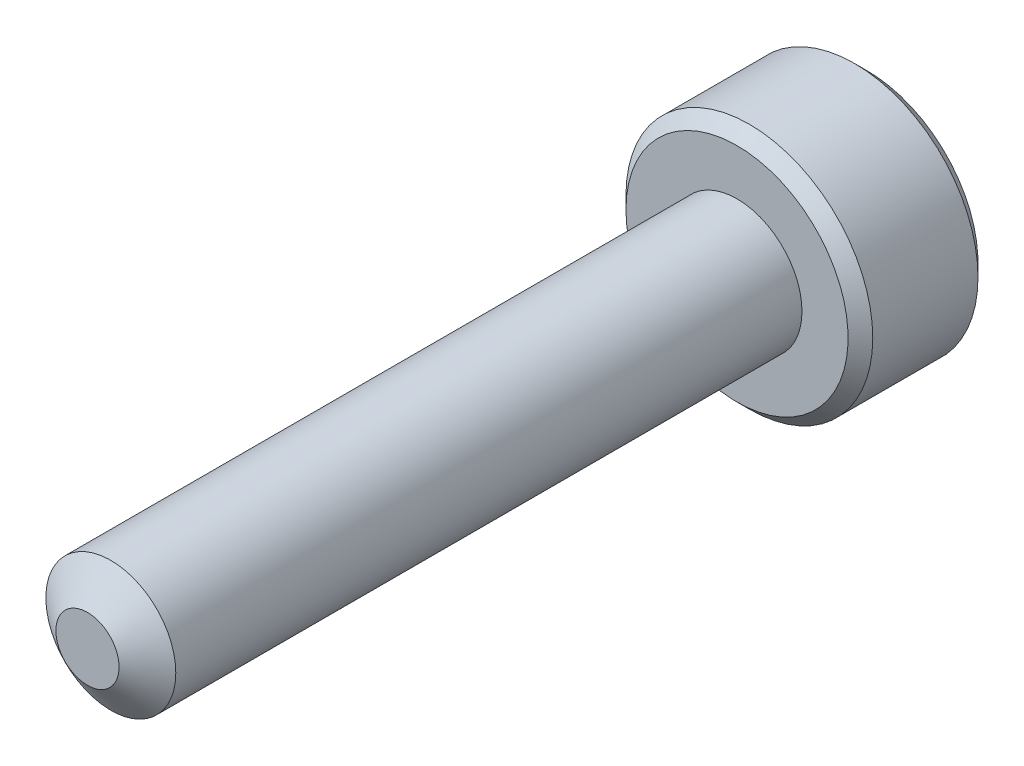
ISO-10303-21;
HEADER;
FILE_DESCRIPTION(('STEP AP214'),'2;1');
FILE_NAME('part.step','',(''),(''),'','','');
FILE_SCHEMA(('AUTOMOTIVE_DESIGN { 1 0 10303 214 1 1 1 1 }'));
ENDSEC;
DATA;
#1=APPLICATION_CONTEXT('core data for automotive mechanical design processes');
#2=APPLICATION_PROTOCOL_DEFINITION('international standard','automotive_design',2000,#1);
#3=PRODUCT_CONTEXT('',#1,'mechanical');
#4=PRODUCT('Part','Part','',(#3));
#5=PRODUCT_RELATED_PRODUCT_CATEGORY('part','',(#4));
#6=PRODUCT_DEFINITION_FORMATION('','',#4);
#7=PRODUCT_DEFINITION_CONTEXT('part definition',#1,'design');
#8=PRODUCT_DEFINITION('design','',#6,#7);
#9=PRODUCT_DEFINITION_SHAPE('','',#8);
#10=(LENGTH_UNIT() NAMED_UNIT(*) SI_UNIT(.MILLI.,.METRE.));
#11=(NAMED_UNIT(*) PLANE_ANGLE_UNIT() SI_UNIT($,.RADIAN.));
#12=(NAMED_UNIT(*) SI_UNIT($,.STERADIAN.) SOLID_ANGLE_UNIT());
#13=UNCERTAINTY_MEASURE_WITH_UNIT(LENGTH_MEASURE(1.E-05),#10,'distance_accuracy_value','');
#14=(GEOMETRIC_REPRESENTATION_CONTEXT(3) GLOBAL_UNCERTAINTY_ASSIGNED_CONTEXT((#13)) GLOBAL_UNIT_ASSIGNED_CONTEXT((#10,
#11,#12)) REPRESENTATION_CONTEXT('',''));
#15=CARTESIAN_POINT('',(0.,0.,0.));
#16=DIRECTION('',(0.,0.,1.));
#17=DIRECTION('',(1.,0.,0.));
#18=AXIS2_PLACEMENT_3D('',#15,#16,#17);
#19=CARTESIAN_POINT('',(0.,0.,-10.));
#20=DIRECTION('',(0.,0.,1.));
#21=DIRECTION('',(1.,0.,0.));
#22=AXIS2_PLACEMENT_3D('',#19,#20,#21);
#23=CYLINDRICAL_SURFACE('',#22,1.);
#24=CARTESIAN_POINT('',(0.,0.,-10.));
#25=DIRECTION('',(0.,0.,-1.));
#26=DIRECTION('',(-1.,0.,0.));
#27=AXIS2_PLACEMENT_3D('',#24,#25,#26);
#28=CIRCLE('',#27,1.);
#29=CARTESIAN_POINT('',(-1.,0.,-10.));
#30=VERTEX_POINT('',#29);
#31=EDGE_CURVE('E226',#30,#30,#28,.F.);
#32=ORIENTED_EDGE('',*,*,#31,.T.);
#33=EDGE_LOOP('',(#32));
#34=FACE_BOUND('',#33,.T.);
#35=CARTESIAN_POINT('',(0.,0.,-0.359771969508557));
#36=DIRECTION('',(0.,0.,1.));
#37=DIRECTION('',(1.,0.,0.));
#38=AXIS2_PLACEMENT_3D('',#35,#36,#37);
#39=CIRCLE('',#38,1.);
#40=CARTESIAN_POINT('',(1.,0.,-0.359771969508557));
#41=VERTEX_POINT('',#40);
#42=EDGE_CURVE('E120',#41,#41,#39,.T.);
#43=ORIENTED_EDGE('',*,*,#42,.F.);
#44=EDGE_LOOP('',(#43));
#45=FACE_BOUND('',#44,.T.);
#46=ADVANCED_FACE('F46',(#34,#45),#23,.T.);
#47=CARTESIAN_POINT('',(0.,0.,0.));
#48=DIRECTION('',(0.,0.,-1.));
#49=DIRECTION('',(-1.,0.,0.));
#50=AXIS2_PLACEMENT_3D('',#47,#48,#49);
#51=CONICAL_SURFACE('',#50,0.486192378864667,0.959931088596884);
#52=ORIENTED_EDGE('',*,*,#42,.T.);
#53=EDGE_LOOP('',(#52));
#54=FACE_BOUND('',#53,.T.);
#55=CARTESIAN_POINT('',(0.,0.,0.));
#56=DIRECTION('',(0.,0.,1.));
#57=DIRECTION('',(1.,0.,0.));
#58=AXIS2_PLACEMENT_3D('',#55,#56,#57);
#59=CIRCLE('',#58,0.486192378864667);
#60=CARTESIAN_POINT('',(0.486192378864667,0.,0.));
#61=VERTEX_POINT('',#60);
#62=EDGE_CURVE('E224',#61,#61,#59,.T.);
#63=ORIENTED_EDGE('',*,*,#62,.F.);
#64=EDGE_LOOP('',(#63));
#65=FACE_BOUND('',#64,.T.);
#66=ADVANCED_FACE('F207',(#54,#65),#51,.T.);
#67=CARTESIAN_POINT('',(0.,0.,0.));
#68=DIRECTION('',(0.,0.,1.));
#69=DIRECTION('',(1.,0.,0.));
#70=AXIS2_PLACEMENT_3D('',#67,#68,#69);
#71=PLANE('',#70);
#72=ORIENTED_EDGE('',*,*,#62,.T.);
#73=EDGE_LOOP('',(#72));
#74=FACE_BOUND('',#73,.T.);
#75=ADVANCED_FACE('F204',(#74),#71,.T.);
#76=CARTESIAN_POINT('',(0.,0.,-12.));
#77=DIRECTION('',(0.,0.,1.));
#78=DIRECTION('',(1.,0.,0.));
#79=AXIS2_PLACEMENT_3D('',#76,#77,#78);
#80=CYLINDRICAL_SURFACE('',#79,1.9);
#81=CARTESIAN_POINT('',(0.,0.,-11.81));
#82=DIRECTION('',(0.,0.,-1.));
#83=DIRECTION('',(-1.,0.,0.));
#84=AXIS2_PLACEMENT_3D('',#81,#82,#83);
#85=CIRCLE('',#84,1.9);
#86=CARTESIAN_POINT('',(-1.9,0.,-11.81));
#87=VERTEX_POINT('',#86);
#88=EDGE_CURVE('E54',#87,#87,#85,.F.);
#89=ORIENTED_EDGE('',*,*,#88,.T.);
#90=EDGE_LOOP('',(#89));
#91=FACE_BOUND('',#90,.T.);
#92=CARTESIAN_POINT('',(0.,0.,-10.19));
#93=DIRECTION('',(0.,0.,-1.));
#94=DIRECTION('',(-1.,0.,0.));
#95=AXIS2_PLACEMENT_3D('',#92,#93,#94);
#96=CIRCLE('',#95,1.9);
#97=CARTESIAN_POINT('',(-1.9,0.,-10.19));
#98=VERTEX_POINT('',#97);
#99=EDGE_CURVE('E183',#98,#98,#96,.T.);
#100=ORIENTED_EDGE('',*,*,#99,.T.);
#101=EDGE_LOOP('',(#100));
#102=FACE_BOUND('',#101,.T.);
#103=ADVANCED_FACE('F188',(#91,#102),#80,.T.);
#104=CARTESIAN_POINT('',(0.,0.,-12.));
#105=DIRECTION('',(0.,0.,-1.));
#106=DIRECTION('',(-1.,0.,0.));
#107=AXIS2_PLACEMENT_3D('',#104,#105,#106);
#108=PLANE('',#107);
#109=CARTESIAN_POINT('',(0.,0.,-12.));
#110=DIRECTION('',(0.,0.,-1.));
#111=DIRECTION('',(-1.,0.,0.));
#112=AXIS2_PLACEMENT_3D('',#109,#110,#111);
#113=CIRCLE('',#112,1.71);
#114=CARTESIAN_POINT('',(-1.71,0.,-12.));
#115=VERTEX_POINT('',#114);
#116=EDGE_CURVE('E119',#115,#115,#113,.T.);
#117=ORIENTED_EDGE('',*,*,#116,.T.);
#118=EDGE_LOOP('',(#117));
#119=FACE_BOUND('',#118,.T.);
#120=CARTESIAN_POINT('',(0.,0.,-12.));
#121=DIRECTION('',(0.,0.,-1.));
#122=DIRECTION('',(-1.,0.,0.));
#123=AXIS2_PLACEMENT_3D('',#120,#121,#122);
#124=CIRCLE('',#123,0.866025403784438);
#125=CARTESIAN_POINT('',(-0.749999999999999,0.43301270189222,-12.));
#126=VERTEX_POINT('',#125);
#127=CARTESIAN_POINT('',(0.,0.866025403784438,-12.));
#128=VERTEX_POINT('',#127);
#129=EDGE_CURVE('E100',#126,#128,#124,.T.);
#130=ORIENTED_EDGE('',*,*,#129,.F.);
#131=CARTESIAN_POINT('',(-0.749999999999999,-0.43301270189222,-12.));
#132=VERTEX_POINT('',#131);
#133=EDGE_CURVE('E60',#132,#126,#124,.T.);
#134=ORIENTED_EDGE('',*,*,#133,.F.);
#135=CARTESIAN_POINT('',(0.,-0.866025403784438,-12.));
#136=VERTEX_POINT('',#135);
#137=EDGE_CURVE('E285',#136,#132,#124,.T.);
#138=ORIENTED_EDGE('',*,*,#137,.F.);
#139=CARTESIAN_POINT('',(0.75,-0.433012701892219,-12.));
#140=VERTEX_POINT('',#139);
#141=EDGE_CURVE('E67',#140,#136,#124,.T.);
#142=ORIENTED_EDGE('',*,*,#141,.F.);
#143=CARTESIAN_POINT('',(0.749999999999999,0.43301270189222,-12.));
#144=VERTEX_POINT('',#143);
#145=EDGE_CURVE('E141',#144,#140,#124,.T.);
#146=ORIENTED_EDGE('',*,*,#145,.F.);
#147=EDGE_CURVE('E109',#128,#144,#124,.T.);
#148=ORIENTED_EDGE('',*,*,#147,.F.);
#149=EDGE_LOOP('',(#130,#134,#138,#142,#146,#148));
#150=FACE_BOUND('',#149,.T.);
#151=ADVANCED_FACE('F140',(#119,#150),#108,.T.);
#152=CARTESIAN_POINT('',(0.,0.,-10.));
#153=DIRECTION('',(0.,0.,-1.));
#154=DIRECTION('',(-1.,0.,0.));
#155=AXIS2_PLACEMENT_3D('',#152,#153,#154);
#156=PLANE('',#155);
#157=CARTESIAN_POINT('',(0.,0.,-10.));
#158=DIRECTION('',(0.,0.,-1.));
#159=DIRECTION('',(-1.,0.,0.));
#160=AXIS2_PLACEMENT_3D('',#157,#158,#159);
#161=CIRCLE('',#160,1.71);
#162=CARTESIAN_POINT('',(-1.71,0.,-10.));
#163=VERTEX_POINT('',#162);
#164=EDGE_CURVE('E13',#163,#163,#161,.F.);
#165=ORIENTED_EDGE('',*,*,#164,.T.);
#166=EDGE_LOOP('',(#165));
#167=FACE_BOUND('',#166,.T.);
#168=ORIENTED_EDGE('',*,*,#31,.F.);
#169=EDGE_LOOP('',(#168));
#170=FACE_BOUND('',#169,.T.);
#171=ADVANCED_FACE('F197',(#167,#170),#156,.F.);
#172=CARTESIAN_POINT('',(0.,0.,-12.));
#173=DIRECTION('',(0.,0.,-1.));
#174=DIRECTION('',(-1.,0.,0.));
#175=AXIS2_PLACEMENT_3D('',#172,#173,#174);
#176=CONICAL_SURFACE('',#175,0.866025403784438,0.78539816339745);
#177=ORIENTED_EDGE('',*,*,#147,.T.);
#178=CARTESIAN_POINT('',(-0.000199999999999593,0.866140873838276,-12.0001154931448));
#179=CARTESIAN_POINT('',(0.0255899625576818,0.851251032013208,-11.9852341104639));
#180=CARTESIAN_POINT('',(0.0518112021286595,0.836112192288419,-11.971226265607));
#181=CARTESIAN_POINT('',(0.105279708235707,0.805242135894348,-11.9455775246823));
#182=CARTESIAN_POINT('',(0.132532067460573,0.789507978959819,-11.9339509117057));
#183=CARTESIAN_POINT('',(0.187485350381353,0.757780686272653,-11.9140340457722));
#184=CARTESIAN_POINT('',(0.21517225669551,0.741795643459147,-11.9056936940814));
#185=CARTESIAN_POINT('',(0.271155595130853,0.709473647943367,-11.8928427419614));
#186=CARTESIAN_POINT('',(0.299450314843645,0.693137683900542,-11.8883225405888));
#187=CARTESIAN_POINT('',(0.348210289268843,0.664986099540475,-11.8842458330974));
#188=CARTESIAN_POINT('',(0.368612065655572,0.65320712845165,-11.8836427966141));
#189=CARTESIAN_POINT('',(0.40937613469636,0.629671982217687,-11.8846545060155));
#190=CARTESIAN_POINT('',(0.429738417651455,0.617915812672247,-11.88626974099));
#191=CARTESIAN_POINT('',(0.490534543086824,0.582815153286451,-11.894336146973));
#192=CARTESIAN_POINT('',(0.530665854996099,0.559645329552698,-11.9040089358277));
#193=CARTESIAN_POINT('',(0.601110400354026,0.518974152327358,-11.9273563179723));
#194=CARTESIAN_POINT('',(0.631753572009086,0.501282308923485,-11.9398085580723));
#195=CARTESIAN_POINT('',(0.691839345804789,0.466591771248069,-11.9678596102309));
#196=CARTESIAN_POINT('',(0.72128548838159,0.449591032904757,-11.9834481859038));
#197=CARTESIAN_POINT('',(0.7502,0.432897231838382,-12.0001154931448));
#198=B_SPLINE_CURVE_WITH_KNOTS('',3,(#178,#179,#180,#181,#182,#183,#184,#185,#186,#187,#188,
#189,#190,#191,#192,#193,#194,#195,#196,#197),.UNSPECIFIED.,.F.,.F.,(4,2,2,2,2,2,2,2,2,4),(0.,
0.0999419466095598,0.200466857654447,0.299393763705717,0.39807129730023,0.468665775681747,
0.539275821398839,0.680536257244566,0.792918418368073,0.904939568716031),.UNSPECIFIED.);
#199=EDGE_CURVE('E114',#128,#144,#198,.T.);
#200=ORIENTED_EDGE('',*,*,#199,.F.);
#201=EDGE_LOOP('',(#177,#200));
#202=FACE_BOUND('',#201,.T.);
#203=ADVANCED_FACE('F115',(#202),#176,.F.);
#204=ORIENTED_EDGE('',*,*,#145,.T.);
#205=CARTESIAN_POINT('',(0.75,-0.863604064974111,-12.2777892582303));
#206=CARTESIAN_POINT('',(0.75,-0.842575879856457,-12.2619149320996));
#207=CARTESIAN_POINT('',(0.75,-0.821430496410148,-12.2461962652706));
#208=CARTESIAN_POINT('',(0.75,-0.778857857530497,-12.2151345207069));
#209=CARTESIAN_POINT('',(0.75,-0.757430533150142,-12.1997915375702));
#210=CARTESIAN_POINT('',(0.75,-0.692340710809909,-12.1542035803594));
#211=CARTESIAN_POINT('',(0.75,-0.648190081142952,-12.1246440918019));
#212=CARTESIAN_POINT('',(0.75,-0.555607181575074,-12.0666155827363));
#213=CARTESIAN_POINT('',(0.75,-0.507074363082498,-12.0383051094017));
#214=CARTESIAN_POINT('',(0.75,-0.407587529818442,-11.9865181117906));
#215=CARTESIAN_POINT('',(0.75,-0.356642419585008,-11.9630252915471));
#216=CARTESIAN_POINT('',(0.75,-0.28016546885011,-11.934286899511));
#217=CARTESIAN_POINT('',(0.75,-0.255770023962927,-11.9260392748236));
#218=CARTESIAN_POINT('',(0.75,-0.206403277923611,-11.9114971754305));
#219=CARTESIAN_POINT('',(0.75,-0.181431937227495,-11.905202835279));
#220=CARTESIAN_POINT('',(0.75,-0.106699879455629,-11.8899931738882));
#221=CARTESIAN_POINT('',(0.75,-0.0561907172329777,-11.8843771847175));
#222=CARTESIAN_POINT('',(0.75,0.0430767231074192,-11.8836282564508));
#223=CARTESIAN_POINT('',(0.75,0.0918322433444376,-11.888123451397));
#224=CARTESIAN_POINT('',(0.75,0.164112195619626,-11.9013373074292));
#225=CARTESIAN_POINT('',(0.75,0.188278676798617,-11.9069014463624));
#226=CARTESIAN_POINT('',(0.75,0.236094480035413,-11.9199231661233));
#227=CARTESIAN_POINT('',(0.75,0.259743845186176,-11.9273805885192));
#228=CARTESIAN_POINT('',(0.75,0.334198278358037,-11.9536664694238));
#229=CARTESIAN_POINT('',(0.75,0.383940060323694,-11.9754903379934));
#230=CARTESIAN_POINT('',(0.75,0.481089224924055,-12.0240118040186));
#231=CARTESIAN_POINT('',(0.75,0.528487417805623,-12.0507269112141));
#232=CARTESIAN_POINT('',(0.75,0.619071540271279,-12.1058428510274));
#233=CARTESIAN_POINT('',(0.75,0.662349745094377,-12.134093945316));
#234=CARTESIAN_POINT('',(0.75,0.726111622992782,-12.1777671469421));
#235=CARTESIAN_POINT('',(0.75,0.747090419026062,-12.1924788603549));
#236=CARTESIAN_POINT('',(0.75,0.788761341261128,-12.222291383928));
#237=CARTESIAN_POINT('',(0.75,0.809453544289149,-12.2373920865822));
#238=CARTESIAN_POINT('',(0.75,0.830026389845271,-12.2526540891176));
#239=B_SPLINE_CURVE_WITH_KNOTS('',3,(#205,#206,#207,#208,#209,#210,#211,#212,#213,#214,#215,
#216,#217,#218,#219,#220,#221,#222,#223,#224,#225,#226,#227,#228,#229,#230,#231,#232,#233,#234,
#235,#236,#237,#238),.UNSPECIFIED.,.F.,.F.,(4,2,2,2,2,2,2,2,2,2,2,2,2,2,2,2,4),(0.,
0.0790398443275135,0.158099390527687,0.317425208734854,0.485845155776512,0.653685658433148,
0.73086980575654,0.808059268815781,0.959469653475934,1.10540290455479,1.1797320311882,
1.25405493994416,1.41653726506484,1.57961304282019,1.73458511685198,1.81145152919337,
1.88829692100168),.UNSPECIFIED.);
#240=EDGE_CURVE('E108',#144,#140,#239,.F.);
#241=ORIENTED_EDGE('',*,*,#240,.F.);
#242=EDGE_LOOP('',(#204,#241));
#243=FACE_BOUND('',#242,.T.);
#244=ADVANCED_FACE('F291',(#243),#176,.F.);
#245=ORIENTED_EDGE('',*,*,#141,.T.);
#246=CARTESIAN_POINT('',(0.7502,-0.432897231838382,-12.0001154931448));
#247=CARTESIAN_POINT('',(0.724410037442318,-0.447787073663449,-11.9852341104639));
#248=CARTESIAN_POINT('',(0.69818879787134,-0.462925913388239,-11.971226265607));
#249=CARTESIAN_POINT('',(0.644720291764293,-0.49379596978231,-11.9455775246823));
#250=CARTESIAN_POINT('',(0.617467932539427,-0.509530126716839,-11.9339509117057));
#251=CARTESIAN_POINT('',(0.562514649618646,-0.541257419404005,-11.9140340457722));
#252=CARTESIAN_POINT('',(0.53482774330449,-0.557242462217511,-11.9056936940814));
#253=CARTESIAN_POINT('',(0.478844404869146,-0.589564457733291,-11.8928427419614));
#254=CARTESIAN_POINT('',(0.450549685156354,-0.605900421776116,-11.8883225405888));
#255=CARTESIAN_POINT('',(0.401789710731156,-0.634052006136184,-11.8842458330974));
#256=CARTESIAN_POINT('',(0.381387934344427,-0.645830977225008,-11.8836427966141));
#257=CARTESIAN_POINT('',(0.340623865303639,-0.669366123458972,-11.8846545060155));
#258=CARTESIAN_POINT('',(0.320261582348544,-0.681122293004411,-11.88626974099));
#259=CARTESIAN_POINT('',(0.259465456913176,-0.716222952390208,-11.894336146973));
#260=CARTESIAN_POINT('',(0.2193341450039,-0.73939277612396,-11.9040089358277));
#261=CARTESIAN_POINT('',(0.148889599645974,-0.7800639533493,-11.9273563179723));
#262=CARTESIAN_POINT('',(0.118246427990913,-0.797755796753173,-11.9398085580723));
#263=CARTESIAN_POINT('',(0.0581606541952102,-0.83244633442859,-11.9678596102309));
#264=CARTESIAN_POINT('',(0.0287145116184093,-0.849447072771901,-11.9834481859038));
#265=CARTESIAN_POINT('',(-0.000199999999999743,-0.866140873838276,-12.0001154931448));
#266=B_SPLINE_CURVE_WITH_KNOTS('',3,(#246,#247,#248,#249,#250,#251,#252,#253,#254,#255,#256,
#257,#258,#259,#260,#261,#262,#263,#264,#265),.UNSPECIFIED.,.F.,.F.,(4,2,2,2,2,2,2,2,2,4),(0.,
0.0999419466095604,0.200466857654447,0.299393763705718,0.398071297300231,0.468665775681748,
0.53927582139884,0.680536257244567,0.792918418368074,0.904939568716032),.UNSPECIFIED.);
#267=EDGE_CURVE('E151',#140,#136,#266,.T.);
#268=ORIENTED_EDGE('',*,*,#267,.F.);
#269=EDGE_LOOP('',(#245,#268));
#270=FACE_BOUND('',#269,.T.);
#271=ADVANCED_FACE('F288',(#270),#176,.F.);
#272=ORIENTED_EDGE('',*,*,#137,.T.);
#273=CARTESIAN_POINT('',(0.000200000000000017,-0.866140873838277,-12.0001154931448));
#274=CARTESIAN_POINT('',(-0.0255899625576813,-0.851251032013209,-11.9852341104639));
#275=CARTESIAN_POINT('',(-0.0518112021286591,-0.836112192288419,-11.971226265607));
#276=CARTESIAN_POINT('',(-0.105279708235706,-0.805242135894348,-11.9455775246823));
#277=CARTESIAN_POINT('',(-0.132532067460573,-0.789507978959819,-11.9339509117057));
#278=CARTESIAN_POINT('',(-0.187485350381353,-0.757780686272653,-11.9140340457722));
#279=CARTESIAN_POINT('',(-0.215172256695509,-0.741795643459147,-11.9056936940814));
#280=CARTESIAN_POINT('',(-0.271155595130853,-0.709473647943367,-11.8928427419614));
#281=CARTESIAN_POINT('',(-0.299450314843645,-0.693137683900542,-11.8883225405888));
#282=CARTESIAN_POINT('',(-0.348210289268844,-0.664986099540474,-11.8842458330974));
#283=CARTESIAN_POINT('',(-0.368612065655573,-0.65320712845165,-11.8836427966141));
#284=CARTESIAN_POINT('',(-0.409376134696361,-0.629671982217687,-11.8846545060155));
#285=CARTESIAN_POINT('',(-0.429738417651456,-0.617915812672247,-11.88626974099));
#286=CARTESIAN_POINT('',(-0.490534543086825,-0.582815153286451,-11.894336146973));
#287=CARTESIAN_POINT('',(-0.5306658549961,-0.559645329552698,-11.9040089358277));
#288=CARTESIAN_POINT('',(-0.601110400354026,-0.518974152327358,-11.9273563179723));
#289=CARTESIAN_POINT('',(-0.631753572009086,-0.501282308923485,-11.9398085580723));
#290=CARTESIAN_POINT('',(-0.691839345804789,-0.466591771248069,-11.9678596102309));
#291=CARTESIAN_POINT('',(-0.72128548838159,-0.449591032904757,-11.9834481859038));
#292=CARTESIAN_POINT('',(-0.750199999999999,-0.432897231838382,-12.0001154931448));
#293=B_SPLINE_CURVE_WITH_KNOTS('',3,(#273,#274,#275,#276,#277,#278,#279,#280,#281,#282,#283,
#284,#285,#286,#287,#288,#289,#290,#291,#292),.UNSPECIFIED.,.F.,.F.,(4,2,2,2,2,2,2,2,2,4),(0.,
0.0999419466095601,0.200466857654446,0.299393763705717,0.398071297300231,0.468665775681748,
0.53927582139884,0.680536257244567,0.792918418368073,0.904939568716031),.UNSPECIFIED.);
#294=EDGE_CURVE('E262',#136,#132,#293,.T.);
#295=ORIENTED_EDGE('',*,*,#294,.F.);
#296=EDGE_LOOP('',(#272,#295));
#297=FACE_BOUND('',#296,.T.);
#298=ADVANCED_FACE('F287',(#297),#176,.F.);
#299=ORIENTED_EDGE('',*,*,#133,.T.);
#300=CARTESIAN_POINT('',(-0.749999999999999,-0.863604064974111,-12.2777892582303));
#301=CARTESIAN_POINT('',(-0.749999999999999,-0.842575879856456,-12.2619149320996));
#302=CARTESIAN_POINT('',(-0.749999999999999,-0.821430496410147,-12.2461962652706));
#303=CARTESIAN_POINT('',(-0.749999999999999,-0.778857857530497,-12.2151345207069));
#304=CARTESIAN_POINT('',(-0.749999999999999,-0.757430533150142,-12.1997915375702));
#305=CARTESIAN_POINT('',(-0.749999999999999,-0.692340710809909,-12.1542035803594));
#306=CARTESIAN_POINT('',(-0.749999999999999,-0.648190081142952,-12.1246440918019));
#307=CARTESIAN_POINT('',(-0.749999999999999,-0.555607181575075,-12.0666155827363));
#308=CARTESIAN_POINT('',(-0.749999999999999,-0.507074363082498,-12.0383051094017));
#309=CARTESIAN_POINT('',(-0.749999999999999,-0.407587529818443,-11.9865181117906));
#310=CARTESIAN_POINT('',(-0.749999999999999,-0.356642419585009,-11.9630252915471));
#311=CARTESIAN_POINT('',(-0.749999999999999,-0.280165468850111,-11.934286899511));
#312=CARTESIAN_POINT('',(-0.749999999999999,-0.255770023962927,-11.9260392748236));
#313=CARTESIAN_POINT('',(-0.749999999999999,-0.206403277923611,-11.9114971754305));
#314=CARTESIAN_POINT('',(-0.749999999999999,-0.181431937227496,-11.905202835279));
#315=CARTESIAN_POINT('',(-0.749999999999999,-0.10669987945563,-11.8899931738882));
#316=CARTESIAN_POINT('',(-0.749999999999999,-0.0561907172329784,-11.8843771847175));
#317=CARTESIAN_POINT('',(-0.749999999999999,0.0430767231074185,-11.8836282564508));
#318=CARTESIAN_POINT('',(-0.749999999999999,0.091832243344437,-11.888123451397));
#319=CARTESIAN_POINT('',(-0.749999999999999,0.164112195619625,-11.9013373074292));
#320=CARTESIAN_POINT('',(-0.749999999999999,0.188278676798617,-11.9069014463624));
#321=CARTESIAN_POINT('',(-0.749999999999999,0.236094480035413,-11.9199231661233));
#322=CARTESIAN_POINT('',(-0.749999999999999,0.259743845186176,-11.9273805885192));
#323=CARTESIAN_POINT('',(-0.749999999999999,0.334198278358037,-11.9536664694238));
#324=CARTESIAN_POINT('',(-0.749999999999999,0.383940060323693,-11.9754903379934));
#325=CARTESIAN_POINT('',(-0.749999999999999,0.481089224924055,-12.0240118040186));
#326=CARTESIAN_POINT('',(-0.749999999999999,0.528487417805623,-12.0507269112141));
#327=CARTESIAN_POINT('',(-0.749999999999999,0.619071540271278,-12.1058428510274));
#328=CARTESIAN_POINT('',(-0.749999999999999,0.662349745094376,-12.134093945316));
#329=CARTESIAN_POINT('',(-0.749999999999999,0.726111622992782,-12.1777671469421));
#330=CARTESIAN_POINT('',(-0.749999999999999,0.747090419026061,-12.1924788603549));
#331=CARTESIAN_POINT('',(-0.749999999999999,0.788761341261127,-12.222291383928));
#332=CARTESIAN_POINT('',(-0.749999999999999,0.809453544289148,-12.2373920865822));
#333=CARTESIAN_POINT('',(-0.749999999999999,0.830026389845269,-12.2526540891176));
#334=B_SPLINE_CURVE_WITH_KNOTS('',3,(#300,#301,#302,#303,#304,#305,#306,#307,#308,#309,#310,
#311,#312,#313,#314,#315,#316,#317,#318,#319,#320,#321,#322,#323,#324,#325,#326,#327,#328,#329,
#330,#331,#332,#333),.UNSPECIFIED.,.F.,.F.,(4,2,2,2,2,2,2,2,2,2,2,2,2,2,2,2,4),(0.,
0.0790398443275119,0.158099390527685,0.317425208734852,0.48584515577651,0.653685658433146,
0.730869805756537,0.808059268815779,0.959469653475931,1.10540290455479,1.1797320311882,
1.25405493994416,1.41653726506483,1.57961304282019,1.73458511685198,1.81145152919336,
1.88829692100168),.UNSPECIFIED.);
#335=EDGE_CURVE('E130',#132,#126,#334,.T.);
#336=ORIENTED_EDGE('',*,*,#335,.F.);
#337=EDGE_LOOP('',(#299,#336));
#338=FACE_BOUND('',#337,.T.);
#339=ADVANCED_FACE('F300',(#338),#176,.F.);
#340=ORIENTED_EDGE('',*,*,#129,.T.);
#341=CARTESIAN_POINT('',(-0.7502,0.432897231838381,-12.0001154931448));
#342=CARTESIAN_POINT('',(-0.724410037442318,0.447787073663449,-11.9852341104639));
#343=CARTESIAN_POINT('',(-0.69818879787134,0.462925913388239,-11.971226265607));
#344=CARTESIAN_POINT('',(-0.644720291764293,0.49379596978231,-11.9455775246823));
#345=CARTESIAN_POINT('',(-0.617467932539427,0.509530126716839,-11.9339509117057));
#346=CARTESIAN_POINT('',(-0.562514649618646,0.541257419404005,-11.9140340457722));
#347=CARTESIAN_POINT('',(-0.53482774330449,0.557242462217511,-11.9056936940814));
#348=CARTESIAN_POINT('',(-0.478844404869147,0.58956445773329,-11.8928427419614));
#349=CARTESIAN_POINT('',(-0.450549685156355,0.605900421776116,-11.8883225405888));
#350=CARTESIAN_POINT('',(-0.401789710731157,0.634052006136183,-11.8842458330974));
#351=CARTESIAN_POINT('',(-0.381387934344427,0.645830977225008,-11.8836427966141));
#352=CARTESIAN_POINT('',(-0.34062386530364,0.669366123458971,-11.8846545060155));
#353=CARTESIAN_POINT('',(-0.320261582348545,0.68112229300441,-11.88626974099));
#354=CARTESIAN_POINT('',(-0.259465456913176,0.716222952390207,-11.894336146973));
#355=CARTESIAN_POINT('',(-0.219334145003901,0.739392776123959,-11.9040089358277));
#356=CARTESIAN_POINT('',(-0.148889599645974,0.780063953349299,-11.9273563179723));
#357=CARTESIAN_POINT('',(-0.118246427990913,0.797755796753173,-11.9398085580723));
#358=CARTESIAN_POINT('',(-0.0581606541952096,0.832446334428589,-11.9678596102309));
#359=CARTESIAN_POINT('',(-0.0287145116184087,0.849447072771901,-11.9834481859038));
#360=CARTESIAN_POINT('',(0.000200000000000486,0.866140873838276,-12.0001154931448));
#361=B_SPLINE_CURVE_WITH_KNOTS('',3,(#341,#342,#343,#344,#345,#346,#347,#348,#349,#350,#351,
#352,#353,#354,#355,#356,#357,#358,#359,#360),.UNSPECIFIED.,.F.,.F.,(4,2,2,2,2,2,2,2,2,4),(0.,
0.0999419466095599,0.200466857654447,0.299393763705718,0.39807129730023,0.468665775681748,
0.539275821398839,0.680536257244566,0.792918418368074,0.904939568716032),.UNSPECIFIED.);
#362=EDGE_CURVE('E104',#126,#128,#361,.T.);
#363=ORIENTED_EDGE('',*,*,#362,.F.);
#364=EDGE_LOOP('',(#340,#363));
#365=FACE_BOUND('',#364,.T.);
#366=ADVANCED_FACE('F102',(#365),#176,.F.);
#367=CARTESIAN_POINT('',(0.749999999999999,1.29903810567666,-10.875));
#368=DIRECTION('',(0.,0.,-1.));
#369=DIRECTION('',(-1.,0.,0.));
#370=AXIS2_PLACEMENT_3D('',#367,#368,#369);
#371=PLANE('',#370);
#372=DIRECTION('',(0.866025403784439,0.5,0.));
#373=VECTOR('',#372,1.);
#374=CARTESIAN_POINT('',(-0.749999999999999,0.433012701892219,-10.875));
#375=LINE('',#374,#373);
#376=CARTESIAN_POINT('',(-0.749999999999999,0.433012701892219,-10.875));
#377=VERTEX_POINT('',#376);
#378=CARTESIAN_POINT('',(0.,0.866025403784438,-10.875));
#379=VERTEX_POINT('',#378);
#380=EDGE_CURVE('E129',#377,#379,#375,.T.);
#381=ORIENTED_EDGE('',*,*,#380,.T.);
#382=DIRECTION('',(0.866025403784439,-0.5,0.));
#383=VECTOR('',#382,1.);
#384=CARTESIAN_POINT('',(0.,0.866025403784438,-10.875));
#385=LINE('',#384,#383);
#386=CARTESIAN_POINT('',(0.75,0.43301270189222,-10.875));
#387=VERTEX_POINT('',#386);
#388=EDGE_CURVE('E134',#379,#387,#385,.T.);
#389=ORIENTED_EDGE('',*,*,#388,.T.);
#390=DIRECTION('',(0.,-1.,0.));
#391=VECTOR('',#390,1.);
#392=CARTESIAN_POINT('',(0.75,0.43301270189222,-10.875));
#393=LINE('',#392,#391);
#394=CARTESIAN_POINT('',(0.75,-0.43301270189222,-10.875));
#395=VERTEX_POINT('',#394);
#396=EDGE_CURVE('E248',#387,#395,#393,.T.);
#397=ORIENTED_EDGE('',*,*,#396,.T.);
#398=DIRECTION('',(-0.866025403784439,-0.5,0.));
#399=VECTOR('',#398,1.);
#400=CARTESIAN_POINT('',(0.75,-0.43301270189222,-10.875));
#401=LINE('',#400,#399);
#402=CARTESIAN_POINT('',(0.,-0.866025403784439,-10.875));
#403=VERTEX_POINT('',#402);
#404=EDGE_CURVE('E245',#395,#403,#401,.T.);
#405=ORIENTED_EDGE('',*,*,#404,.T.);
#406=DIRECTION('',(-0.866025403784439,0.5,0.));
#407=VECTOR('',#406,1.);
#408=CARTESIAN_POINT('',(0.,-0.866025403784439,-10.875));
#409=LINE('',#408,#407);
#410=CARTESIAN_POINT('',(-0.749999999999999,-0.43301270189222,-10.875));
#411=VERTEX_POINT('',#410);
#412=EDGE_CURVE('E242',#403,#411,#409,.T.);
#413=ORIENTED_EDGE('',*,*,#412,.T.);
#414=DIRECTION('',(0.,1.,0.));
#415=VECTOR('',#414,1.);
#416=CARTESIAN_POINT('',(-0.749999999999999,-0.43301270189222,-10.875));
#417=LINE('',#416,#415);
#418=EDGE_CURVE('E137',#411,#377,#417,.T.);
#419=ORIENTED_EDGE('',*,*,#418,.T.);
#420=EDGE_LOOP('',(#381,#389,#397,#405,#413,#419));
#421=FACE_BOUND('',#420,.T.);
#422=ADVANCED_FACE('F171',(#421),#371,.T.);
#423=CARTESIAN_POINT('',(0.,0.866025403784438,-10.875));
#424=DIRECTION('',(0.5,0.866025403784439,0.));
#425=DIRECTION('',(-0.866025403784439,0.5,0.));
#426=AXIS2_PLACEMENT_3D('',#423,#424,#425);
#427=PLANE('',#426);
#428=DIRECTION('',(0.,0.,-1.));
#429=VECTOR('',#428,1.);
#430=CARTESIAN_POINT('',(0.,0.866025403784438,-10.875));
#431=LINE('',#430,#429);
#432=EDGE_CURVE('E126',#379,#128,#431,.T.);
#433=ORIENTED_EDGE('',*,*,#432,.T.);
#434=ORIENTED_EDGE('',*,*,#199,.T.);
#435=DIRECTION('',(0.,0.,-1.));
#436=VECTOR('',#435,1.);
#437=CARTESIAN_POINT('',(0.75,0.43301270189222,-10.875));
#438=LINE('',#437,#436);
#439=EDGE_CURVE('E136',#387,#144,#438,.T.);
#440=ORIENTED_EDGE('',*,*,#439,.F.);
#441=ORIENTED_EDGE('',*,*,#388,.F.);
#442=EDGE_LOOP('',(#433,#434,#440,#441));
#443=FACE_BOUND('',#442,.T.);
#444=ADVANCED_FACE('F132',(#443),#427,.F.);
#445=CARTESIAN_POINT('',(0.75,0.43301270189222,-10.875));
#446=DIRECTION('',(1.,0.,0.));
#447=DIRECTION('',(0.,1.,0.));
#448=AXIS2_PLACEMENT_3D('',#445,#446,#447);
#449=PLANE('',#448);
#450=ORIENTED_EDGE('',*,*,#439,.T.);
#451=ORIENTED_EDGE('',*,*,#240,.T.);
#452=DIRECTION('',(0.,0.,-1.));
#453=VECTOR('',#452,1.);
#454=CARTESIAN_POINT('',(0.75,-0.43301270189222,-10.875));
#455=LINE('',#454,#453);
#456=EDGE_CURVE('E231',#395,#140,#455,.T.);
#457=ORIENTED_EDGE('',*,*,#456,.F.);
#458=ORIENTED_EDGE('',*,*,#396,.F.);
#459=EDGE_LOOP('',(#450,#451,#457,#458));
#460=FACE_BOUND('',#459,.T.);
#461=ADVANCED_FACE('F160',(#460),#449,.F.);
#462=CARTESIAN_POINT('',(0.75,-0.43301270189222,-10.875));
#463=DIRECTION('',(0.5,-0.866025403784439,0.));
#464=DIRECTION('',(0.866025403784439,0.5,0.));
#465=AXIS2_PLACEMENT_3D('',#462,#463,#464);
#466=PLANE('',#465);
#467=ORIENTED_EDGE('',*,*,#456,.T.);
#468=ORIENTED_EDGE('',*,*,#267,.T.);
#469=DIRECTION('',(0.,0.,-1.));
#470=VECTOR('',#469,1.);
#471=CARTESIAN_POINT('',(0.,-0.866025403784439,-10.875));
#472=LINE('',#471,#470);
#473=EDGE_CURVE('E234',#403,#136,#472,.T.);
#474=ORIENTED_EDGE('',*,*,#473,.F.);
#475=ORIENTED_EDGE('',*,*,#404,.F.);
#476=EDGE_LOOP('',(#467,#468,#474,#475));
#477=FACE_BOUND('',#476,.T.);
#478=ADVANCED_FACE('F164',(#477),#466,.F.);
#479=CARTESIAN_POINT('',(0.,-0.866025403784439,-10.875));
#480=DIRECTION('',(-0.5,-0.866025403784439,0.));
#481=DIRECTION('',(0.866025403784439,-0.5,0.));
#482=AXIS2_PLACEMENT_3D('',#479,#480,#481);
#483=PLANE('',#482);
#484=ORIENTED_EDGE('',*,*,#473,.T.);
#485=ORIENTED_EDGE('',*,*,#294,.T.);
#486=DIRECTION('',(0.,0.,-1.));
#487=VECTOR('',#486,1.);
#488=CARTESIAN_POINT('',(-0.749999999999999,-0.43301270189222,-10.875));
#489=LINE('',#488,#487);
#490=EDGE_CURVE('E237',#411,#132,#489,.T.);
#491=ORIENTED_EDGE('',*,*,#490,.F.);
#492=ORIENTED_EDGE('',*,*,#412,.F.);
#493=EDGE_LOOP('',(#484,#485,#491,#492));
#494=FACE_BOUND('',#493,.T.);
#495=ADVANCED_FACE('F270',(#494),#483,.F.);
#496=CARTESIAN_POINT('',(-0.749999999999999,-0.43301270189222,-10.875));
#497=DIRECTION('',(-1.,0.,0.));
#498=DIRECTION('',(0.,-1.,0.));
#499=AXIS2_PLACEMENT_3D('',#496,#497,#498);
#500=PLANE('',#499);
#501=ORIENTED_EDGE('',*,*,#490,.T.);
#502=ORIENTED_EDGE('',*,*,#335,.T.);
#503=DIRECTION('',(0.,0.,-1.));
#504=VECTOR('',#503,1.);
#505=CARTESIAN_POINT('',(-0.749999999999999,0.433012701892219,-10.875));
#506=LINE('',#505,#504);
#507=EDGE_CURVE('E128',#377,#126,#506,.T.);
#508=ORIENTED_EDGE('',*,*,#507,.F.);
#509=ORIENTED_EDGE('',*,*,#418,.F.);
#510=EDGE_LOOP('',(#501,#502,#508,#509));
#511=FACE_BOUND('',#510,.T.);
#512=ADVANCED_FACE('F267',(#511),#500,.F.);
#513=CARTESIAN_POINT('',(-0.749999999999999,0.433012701892219,-10.875));
#514=DIRECTION('',(-0.5,0.866025403784439,0.));
#515=DIRECTION('',(-0.866025403784439,-0.5,0.));
#516=AXIS2_PLACEMENT_3D('',#513,#514,#515);
#517=PLANE('',#516);
#518=ORIENTED_EDGE('',*,*,#507,.T.);
#519=ORIENTED_EDGE('',*,*,#362,.T.);
#520=ORIENTED_EDGE('',*,*,#432,.F.);
#521=ORIENTED_EDGE('',*,*,#380,.F.);
#522=EDGE_LOOP('',(#518,#519,#520,#521));
#523=FACE_BOUND('',#522,.T.);
#524=ADVANCED_FACE('F124',(#523),#517,.F.);
#525=CARTESIAN_POINT('',(0.,0.,-12.));
#526=DIRECTION('',(0.,0.,1.));
#527=DIRECTION('',(1.,0.,0.));
#528=AXIS2_PLACEMENT_3D('',#525,#526,#527);
#529=CONICAL_SURFACE('',#528,1.71,0.785398163397442);
#530=ORIENTED_EDGE('',*,*,#88,.F.);
#531=EDGE_LOOP('',(#530));
#532=FACE_BOUND('',#531,.T.);
#533=ORIENTED_EDGE('',*,*,#116,.F.);
#534=EDGE_LOOP('',(#533));
#535=FACE_BOUND('',#534,.T.);
#536=ADVANCED_FACE('F191',(#532,#535),#529,.T.);
#537=CARTESIAN_POINT('',(0.,0.,-10.19));
#538=DIRECTION('',(0.,0.,-1.));
#539=DIRECTION('',(-1.,0.,0.));
#540=AXIS2_PLACEMENT_3D('',#537,#538,#539);
#541=CONICAL_SURFACE('',#540,1.9,0.785398163397444);
#542=ORIENTED_EDGE('',*,*,#164,.F.);
#543=EDGE_LOOP('',(#542));
#544=FACE_BOUND('',#543,.T.);
#545=ORIENTED_EDGE('',*,*,#99,.F.);
#546=EDGE_LOOP('',(#545));
#547=FACE_BOUND('',#546,.T.);
#548=ADVANCED_FACE('F48',(#544,#547),#541,.T.);
#549=CLOSED_SHELL('',(#46,#66,#75,#103,#151,#171,#203,#244,#271,#298,#339,#366,#422,#444,#461,
#478,#495,#512,#524,#536,#548));
#550=MANIFOLD_SOLID_BREP('B2',#549);
#551=ADVANCED_BREP_SHAPE_REPRESENTATION('',(#18,#550),#14);
#552=SHAPE_DEFINITION_REPRESENTATION(#9,#551);
ENDSEC;
END-ISO-10303-21;
